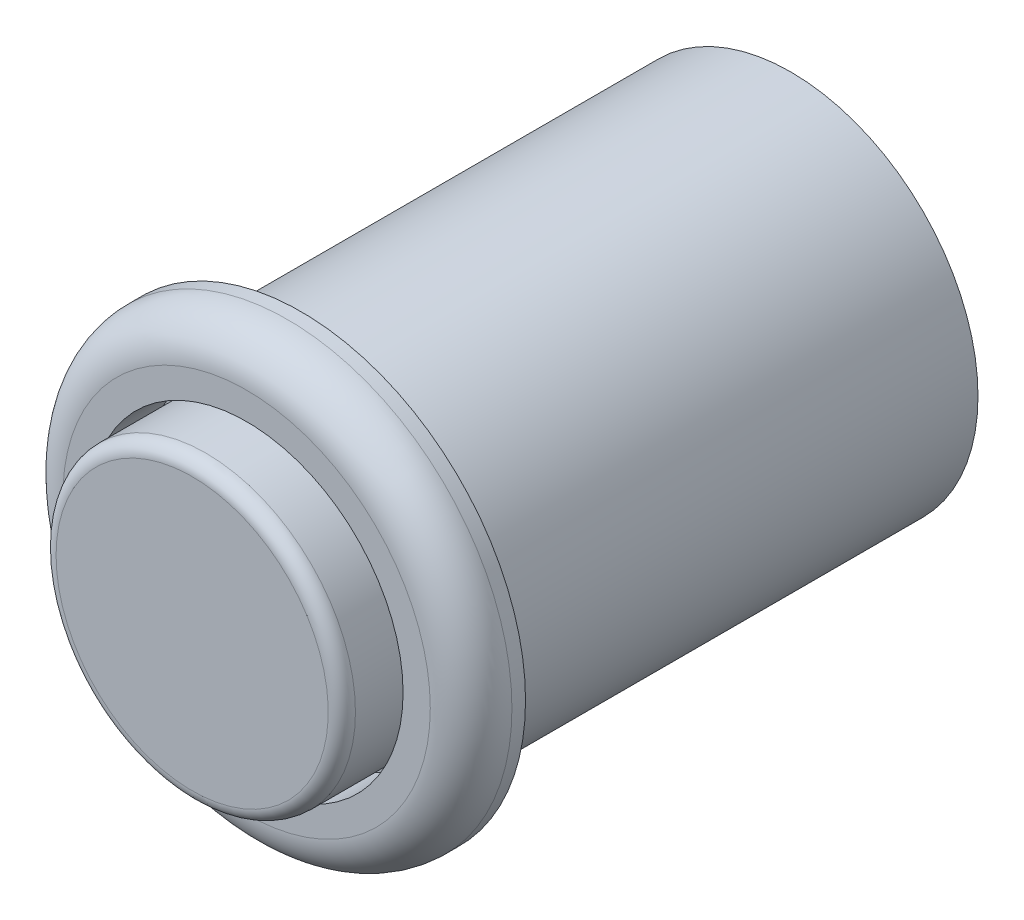
ISO-10303-21;
HEADER;
FILE_DESCRIPTION(('STEP AP214'),'2;1');
FILE_NAME('part.step','',(''),(''),'','','');
FILE_SCHEMA(('AUTOMOTIVE_DESIGN { 1 0 10303 214 1 1 1 1 }'));
ENDSEC;
DATA;
#1=APPLICATION_CONTEXT('core data for automotive mechanical design processes');
#2=APPLICATION_PROTOCOL_DEFINITION('international standard','automotive_design',2000,#1);
#3=PRODUCT_CONTEXT('',#1,'mechanical');
#4=PRODUCT('Part','Part','',(#3));
#5=PRODUCT_RELATED_PRODUCT_CATEGORY('part','',(#4));
#6=PRODUCT_DEFINITION_FORMATION('','',#4);
#7=PRODUCT_DEFINITION_CONTEXT('part definition',#1,'design');
#8=PRODUCT_DEFINITION('design','',#6,#7);
#9=PRODUCT_DEFINITION_SHAPE('','',#8);
#10=(LENGTH_UNIT() NAMED_UNIT(*) SI_UNIT(.MILLI.,.METRE.));
#11=(NAMED_UNIT(*) PLANE_ANGLE_UNIT() SI_UNIT($,.RADIAN.));
#12=(NAMED_UNIT(*) SI_UNIT($,.STERADIAN.) SOLID_ANGLE_UNIT());
#13=UNCERTAINTY_MEASURE_WITH_UNIT(LENGTH_MEASURE(1.E-05),#10,'distance_accuracy_value','');
#14=(GEOMETRIC_REPRESENTATION_CONTEXT(3) GLOBAL_UNCERTAINTY_ASSIGNED_CONTEXT((#13)) GLOBAL_UNIT_ASSIGNED_CONTEXT((#10,
#11,#12)) REPRESENTATION_CONTEXT('',''));
#15=CARTESIAN_POINT('',(0.,0.,0.));
#16=DIRECTION('',(0.,0.,1.));
#17=DIRECTION('',(1.,0.,0.));
#18=AXIS2_PLACEMENT_3D('',#15,#16,#17);
#19=CARTESIAN_POINT('',(0.,0.,4.));
#20=DIRECTION('',(0.,0.,1.));
#21=DIRECTION('',(1.,0.,0.));
#22=AXIS2_PLACEMENT_3D('',#19,#20,#21);
#23=PLANE('',#22);
#24=CARTESIAN_POINT('',(0.,0.,4.));
#25=DIRECTION('',(0.,0.,1.));
#26=DIRECTION('',(1.,0.,0.));
#27=AXIS2_PLACEMENT_3D('',#24,#25,#26);
#28=CIRCLE('',#27,13.5);
#29=CARTESIAN_POINT('',(13.5,0.,4.));
#30=VERTEX_POINT('',#29);
#31=EDGE_CURVE('E42',#30,#30,#28,.T.);
#32=ORIENTED_EDGE('',*,*,#31,.T.);
#33=EDGE_LOOP('',(#32));
#34=FACE_BOUND('',#33,.T.);
#35=CARTESIAN_POINT('',(0.,0.,4.));
#36=DIRECTION('',(0.,0.,1.));
#37=DIRECTION('',(1.,0.,0.));
#38=AXIS2_PLACEMENT_3D('',#35,#36,#37);
#39=CIRCLE('',#38,11.5);
#40=CARTESIAN_POINT('',(11.5,0.,4.));
#41=VERTEX_POINT('',#40);
#42=EDGE_CURVE('E51',#41,#41,#39,.T.);
#43=ORIENTED_EDGE('',*,*,#42,.F.);
#44=EDGE_LOOP('',(#43));
#45=FACE_BOUND('',#44,.T.);
#46=ADVANCED_FACE('F31',(#34,#45),#23,.T.);
#47=CARTESIAN_POINT('',(0.,0.,0.));
#48=DIRECTION('',(0.,0.,1.));
#49=DIRECTION('',(1.,0.,0.));
#50=AXIS2_PLACEMENT_3D('',#47,#48,#49);
#51=PLANE('',#50);
#52=CARTESIAN_POINT('',(0.,0.,0.));
#53=DIRECTION('',(0.,0.,1.));
#54=DIRECTION('',(1.,0.,0.));
#55=AXIS2_PLACEMENT_3D('',#52,#53,#54);
#56=CIRCLE('',#55,13.75);
#57=CARTESIAN_POINT('',(13.75,0.,0.));
#58=VERTEX_POINT('',#57);
#59=EDGE_CURVE('E10',#58,#58,#56,.F.);
#60=ORIENTED_EDGE('',*,*,#59,.F.);
#61=EDGE_LOOP('',(#60));
#62=FACE_BOUND('',#61,.T.);
#63=CARTESIAN_POINT('',(0.,0.,0.));
#64=DIRECTION('',(0.,0.,1.));
#65=DIRECTION('',(1.,0.,0.));
#66=AXIS2_PLACEMENT_3D('',#63,#64,#65);
#67=CIRCLE('',#66,16.5);
#68=CARTESIAN_POINT('',(16.5,0.,0.));
#69=VERTEX_POINT('',#68);
#70=EDGE_CURVE('E46',#69,#69,#67,.T.);
#71=ORIENTED_EDGE('',*,*,#70,.F.);
#72=EDGE_LOOP('',(#71));
#73=FACE_BOUND('',#72,.T.);
#74=ADVANCED_FACE('F91',(#62,#73),#51,.F.);
#75=CARTESIAN_POINT('',(0.,0.,4.));
#76=DIRECTION('',(0.,0.,-1.));
#77=DIRECTION('',(-1.,0.,0.));
#78=AXIS2_PLACEMENT_3D('',#75,#76,#77);
#79=CYLINDRICAL_SURFACE('',#78,16.5);
#80=CARTESIAN_POINT('',(0.,0.,1.));
#81=DIRECTION('',(0.,0.,1.));
#82=DIRECTION('',(1.,0.,0.));
#83=AXIS2_PLACEMENT_3D('',#80,#81,#82);
#84=CIRCLE('',#83,16.5);
#85=CARTESIAN_POINT('',(16.5,0.,1.));
#86=VERTEX_POINT('',#85);
#87=EDGE_CURVE('E38',#86,#86,#84,.F.);
#88=ORIENTED_EDGE('',*,*,#87,.T.);
#89=EDGE_LOOP('',(#88));
#90=FACE_BOUND('',#89,.T.);
#91=ORIENTED_EDGE('',*,*,#70,.T.);
#92=EDGE_LOOP('',(#91));
#93=FACE_BOUND('',#92,.T.);
#94=ADVANCED_FACE('F97',(#90,#93),#79,.T.);
#95=CARTESIAN_POINT('',(0.,0.,4.));
#96=DIRECTION('',(0.,0.,-1.));
#97=DIRECTION('',(-1.,0.,0.));
#98=AXIS2_PLACEMENT_3D('',#95,#96,#97);
#99=CYLINDRICAL_SURFACE('',#98,11.5);
#100=ORIENTED_EDGE('',*,*,#42,.T.);
#101=EDGE_LOOP('',(#100));
#102=FACE_BOUND('',#101,.T.);
#103=CARTESIAN_POINT('',(0.,0.,0.));
#104=DIRECTION('',(0.,0.,1.));
#105=DIRECTION('',(1.,0.,0.));
#106=AXIS2_PLACEMENT_3D('',#103,#104,#105);
#107=CIRCLE('',#106,11.5);
#108=CARTESIAN_POINT('',(11.5,0.,0.));
#109=VERTEX_POINT('',#108);
#110=EDGE_CURVE('E52',#109,#109,#107,.T.);
#111=ORIENTED_EDGE('',*,*,#110,.F.);
#112=EDGE_LOOP('',(#111));
#113=FACE_BOUND('',#112,.T.);
#114=ADVANCED_FACE('F102',(#102,#113),#99,.F.);
#115=CARTESIAN_POINT('',(0.,0.,1.));
#116=DIRECTION('',(0.,0.,1.));
#117=DIRECTION('',(1.,0.,0.));
#118=AXIS2_PLACEMENT_3D('',#115,#116,#117);
#119=TOROIDAL_SURFACE('',#118,13.5,3.);
#120=ORIENTED_EDGE('',*,*,#87,.F.);
#121=EDGE_LOOP('',(#120));
#122=FACE_BOUND('',#121,.T.);
#123=ORIENTED_EDGE('',*,*,#31,.F.);
#124=EDGE_LOOP('',(#123));
#125=FACE_BOUND('',#124,.T.);
#126=ADVANCED_FACE('F33',(#122,#125),#119,.T.);
#127=CARTESIAN_POINT('',(0.,0.,0.));
#128=DIRECTION('',(0.,0.,-1.));
#129=DIRECTION('',(-1.,0.,0.));
#130=AXIS2_PLACEMENT_3D('',#127,#128,#129);
#131=PLANE('',#130);
#132=CARTESIAN_POINT('',(0.,0.,0.));
#133=DIRECTION('',(0.,0.,-1.));
#134=DIRECTION('',(-1.,0.,0.));
#135=AXIS2_PLACEMENT_3D('',#132,#133,#134);
#136=CIRCLE('',#135,11.);
#137=CARTESIAN_POINT('',(-11.,0.,0.));
#138=VERTEX_POINT('',#137);
#139=EDGE_CURVE('E66',#138,#138,#136,.T.);
#140=ORIENTED_EDGE('',*,*,#139,.T.);
#141=EDGE_LOOP('',(#140));
#142=FACE_BOUND('',#141,.T.);
#143=ORIENTED_EDGE('',*,*,#110,.T.);
#144=EDGE_LOOP('',(#143));
#145=FACE_BOUND('',#144,.T.);
#146=ADVANCED_FACE('F70',(#142,#145),#131,.F.);
#147=CARTESIAN_POINT('',(0.,0.,-36.));
#148=DIRECTION('',(0.,0.,1.));
#149=DIRECTION('',(1.,0.,0.));
#150=AXIS2_PLACEMENT_3D('',#147,#148,#149);
#151=CYLINDRICAL_SURFACE('',#150,13.75);
#152=CARTESIAN_POINT('',(0.,0.,-36.));
#153=DIRECTION('',(0.,0.,-1.));
#154=DIRECTION('',(-1.,0.,0.));
#155=AXIS2_PLACEMENT_3D('',#152,#153,#154);
#156=CIRCLE('',#155,13.75);
#157=CARTESIAN_POINT('',(-13.75,0.,-36.));
#158=VERTEX_POINT('',#157);
#159=EDGE_CURVE('E55',#158,#158,#156,.T.);
#160=ORIENTED_EDGE('',*,*,#159,.F.);
#161=EDGE_LOOP('',(#160));
#162=FACE_BOUND('',#161,.T.);
#163=ORIENTED_EDGE('',*,*,#59,.T.);
#164=EDGE_LOOP('',(#163));
#165=FACE_BOUND('',#164,.T.);
#166=ADVANCED_FACE('F86',(#162,#165),#151,.T.);
#167=CARTESIAN_POINT('',(0.,0.,-36.));
#168=DIRECTION('',(0.,0.,-1.));
#169=DIRECTION('',(-1.,0.,0.));
#170=AXIS2_PLACEMENT_3D('',#167,#168,#169);
#171=PLANE('',#170);
#172=ORIENTED_EDGE('',*,*,#159,.T.);
#173=EDGE_LOOP('',(#172));
#174=FACE_BOUND('',#173,.T.);
#175=ADVANCED_FACE('F76',(#174),#171,.T.);
#176=CARTESIAN_POINT('',(0.,0.,8.));
#177=DIRECTION('',(0.,0.,-1.));
#178=DIRECTION('',(-1.,0.,0.));
#179=AXIS2_PLACEMENT_3D('',#176,#177,#178);
#180=CYLINDRICAL_SURFACE('',#179,11.);
#181=CARTESIAN_POINT('',(0.,0.,7.));
#182=DIRECTION('',(0.,0.,-1.));
#183=DIRECTION('',(-1.,0.,0.));
#184=AXIS2_PLACEMENT_3D('',#181,#182,#183);
#185=CIRCLE('',#184,11.);
#186=CARTESIAN_POINT('',(-11.,0.,7.));
#187=VERTEX_POINT('',#186);
#188=EDGE_CURVE('E63',#187,#187,#185,.T.);
#189=ORIENTED_EDGE('',*,*,#188,.T.);
#190=EDGE_LOOP('',(#189));
#191=FACE_BOUND('',#190,.T.);
#192=ORIENTED_EDGE('',*,*,#139,.F.);
#193=EDGE_LOOP('',(#192));
#194=FACE_BOUND('',#193,.T.);
#195=ADVANCED_FACE('F73',(#191,#194),#180,.T.);
#196=CARTESIAN_POINT('',(0.,0.,8.));
#197=DIRECTION('',(0.,0.,-1.));
#198=DIRECTION('',(-1.,0.,0.));
#199=AXIS2_PLACEMENT_3D('',#196,#197,#198);
#200=PLANE('',#199);
#201=CARTESIAN_POINT('',(0.,0.,8.));
#202=DIRECTION('',(0.,0.,-1.));
#203=DIRECTION('',(-1.,0.,0.));
#204=AXIS2_PLACEMENT_3D('',#201,#202,#203);
#205=CIRCLE('',#204,10.);
#206=CARTESIAN_POINT('',(-10.,0.,8.));
#207=VERTEX_POINT('',#206);
#208=EDGE_CURVE('E60',#207,#207,#205,.F.);
#209=ORIENTED_EDGE('',*,*,#208,.T.);
#210=EDGE_LOOP('',(#209));
#211=FACE_BOUND('',#210,.T.);
#212=ADVANCED_FACE('F75',(#211),#200,.F.);
#213=CARTESIAN_POINT('',(0.,0.,7.));
#214=DIRECTION('',(0.,0.,-1.));
#215=DIRECTION('',(-1.,0.,0.));
#216=AXIS2_PLACEMENT_3D('',#213,#214,#215);
#217=TOROIDAL_SURFACE('',#216,10.,1.);
#218=ORIENTED_EDGE('',*,*,#208,.F.);
#219=EDGE_LOOP('',(#218));
#220=FACE_BOUND('',#219,.T.);
#221=ORIENTED_EDGE('',*,*,#188,.F.);
#222=EDGE_LOOP('',(#221));
#223=FACE_BOUND('',#222,.T.);
#224=ADVANCED_FACE('F83',(#220,#223),#217,.T.);
#225=CLOSED_SHELL('',(#46,#74,#94,#114,#126,#146,#166,#175,#195,#212,#224));
#226=MANIFOLD_SOLID_BREP('B2',#225);
#227=ADVANCED_BREP_SHAPE_REPRESENTATION('',(#18,#226),#14);
#228=SHAPE_DEFINITION_REPRESENTATION(#9,#227);
ENDSEC;
END-ISO-10303-21;
